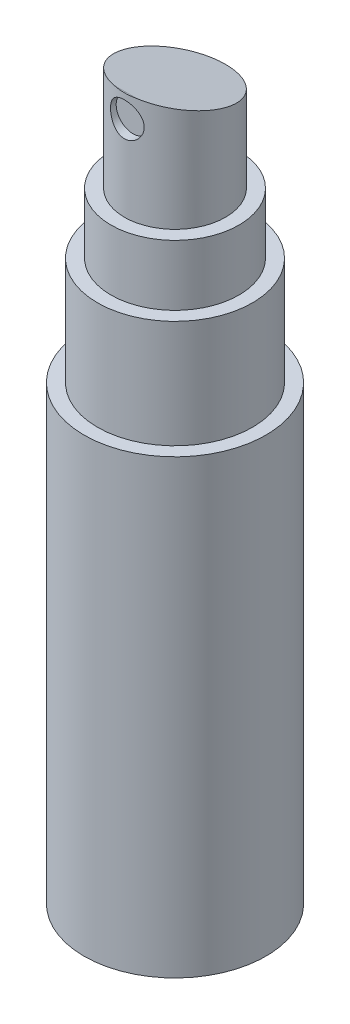
ISO-10303-21;
HEADER;
FILE_DESCRIPTION(('STEP AP214'),'2;1');
FILE_NAME('part.step','',(''),(''),'','','');
FILE_SCHEMA(('AUTOMOTIVE_DESIGN { 1 0 10303 214 1 1 1 1 }'));
ENDSEC;
DATA;
#1=APPLICATION_CONTEXT('core data for automotive mechanical design processes');
#2=APPLICATION_PROTOCOL_DEFINITION('international standard','automotive_design',2000,#1);
#3=PRODUCT_CONTEXT('',#1,'mechanical');
#4=PRODUCT('Part','Part','',(#3));
#5=PRODUCT_RELATED_PRODUCT_CATEGORY('part','',(#4));
#6=PRODUCT_DEFINITION_FORMATION('','',#4);
#7=PRODUCT_DEFINITION_CONTEXT('part definition',#1,'design');
#8=PRODUCT_DEFINITION('design','',#6,#7);
#9=PRODUCT_DEFINITION_SHAPE('','',#8);
#10=(LENGTH_UNIT() NAMED_UNIT(*) SI_UNIT(.MILLI.,.METRE.));
#11=(NAMED_UNIT(*) PLANE_ANGLE_UNIT() SI_UNIT($,.RADIAN.));
#12=(NAMED_UNIT(*) SI_UNIT($,.STERADIAN.) SOLID_ANGLE_UNIT());
#13=UNCERTAINTY_MEASURE_WITH_UNIT(LENGTH_MEASURE(1.E-05),#10,'distance_accuracy_value','');
#14=(GEOMETRIC_REPRESENTATION_CONTEXT(3) GLOBAL_UNCERTAINTY_ASSIGNED_CONTEXT((#13)) GLOBAL_UNIT_ASSIGNED_CONTEXT((#10,
#11,#12)) REPRESENTATION_CONTEXT('',''));
#15=CARTESIAN_POINT('',(0.,0.,0.));
#16=DIRECTION('',(0.,0.,1.));
#17=DIRECTION('',(1.,0.,0.));
#18=AXIS2_PLACEMENT_3D('',#15,#16,#17);
#19=CARTESIAN_POINT('',(0.,67.,0.));
#20=DIRECTION('',(0.,-1.,0.));
#21=DIRECTION('',(0.,0.,-1.));
#22=AXIS2_PLACEMENT_3D('',#19,#20,#21);
#23=CYLINDRICAL_SURFACE('',#22,13.5);
#24=CARTESIAN_POINT('',(0.,67.,0.));
#25=DIRECTION('',(0.,1.,0.));
#26=DIRECTION('',(0.,0.,1.));
#27=AXIS2_PLACEMENT_3D('',#24,#25,#26);
#28=CIRCLE('',#27,13.5);
#29=CARTESIAN_POINT('',(0.,67.,13.5));
#30=VERTEX_POINT('',#29);
#31=EDGE_CURVE('E88',#30,#30,#28,.T.);
#32=ORIENTED_EDGE('',*,*,#31,.F.);
#33=EDGE_LOOP('',(#32));
#34=FACE_BOUND('',#33,.T.);
#35=CARTESIAN_POINT('',(0.,0.,0.));
#36=DIRECTION('',(0.,1.,0.));
#37=DIRECTION('',(0.,0.,1.));
#38=AXIS2_PLACEMENT_3D('',#35,#36,#37);
#39=CIRCLE('',#38,13.5);
#40=CARTESIAN_POINT('',(0.,0.,13.5));
#41=VERTEX_POINT('',#40);
#42=EDGE_CURVE('E85',#41,#41,#39,.T.);
#43=ORIENTED_EDGE('',*,*,#42,.T.);
#44=EDGE_LOOP('',(#43));
#45=FACE_BOUND('',#44,.T.);
#46=ADVANCED_FACE('F38',(#34,#45),#23,.T.);
#47=CARTESIAN_POINT('',(0.,67.,0.));
#48=DIRECTION('',(0.,1.,0.));
#49=DIRECTION('',(0.,0.,1.));
#50=AXIS2_PLACEMENT_3D('',#47,#48,#49);
#51=PLANE('',#50);
#52=CARTESIAN_POINT('',(0.,67.,0.));
#53=DIRECTION('',(0.,1.,0.));
#54=DIRECTION('',(0.,0.,1.));
#55=AXIS2_PLACEMENT_3D('',#52,#53,#54);
#56=CIRCLE('',#55,11.5);
#57=CARTESIAN_POINT('',(0.,67.,11.5));
#58=VERTEX_POINT('',#57);
#59=EDGE_CURVE('E82',#58,#58,#56,.T.);
#60=ORIENTED_EDGE('',*,*,#59,.F.);
#61=EDGE_LOOP('',(#60));
#62=FACE_BOUND('',#61,.T.);
#63=ORIENTED_EDGE('',*,*,#31,.T.);
#64=EDGE_LOOP('',(#63));
#65=FACE_BOUND('',#64,.T.);
#66=ADVANCED_FACE('F98',(#62,#65),#51,.T.);
#67=CARTESIAN_POINT('',(0.,0.,0.));
#68=DIRECTION('',(0.,1.,0.));
#69=DIRECTION('',(0.,0.,1.));
#70=AXIS2_PLACEMENT_3D('',#67,#68,#69);
#71=PLANE('',#70);
#72=ORIENTED_EDGE('',*,*,#42,.F.);
#73=EDGE_LOOP('',(#72));
#74=FACE_BOUND('',#73,.T.);
#75=ADVANCED_FACE('F95',(#74),#71,.F.);
#76=CARTESIAN_POINT('',(0.,83.,0.));
#77=DIRECTION('',(0.,-1.,0.));
#78=DIRECTION('',(0.,0.,-1.));
#79=AXIS2_PLACEMENT_3D('',#76,#77,#78);
#80=CYLINDRICAL_SURFACE('',#79,11.5);
#81=CARTESIAN_POINT('',(0.,83.,0.));
#82=DIRECTION('',(0.,1.,0.));
#83=DIRECTION('',(0.,0.,1.));
#84=AXIS2_PLACEMENT_3D('',#81,#82,#83);
#85=CIRCLE('',#84,11.5);
#86=CARTESIAN_POINT('',(0.,83.,11.5));
#87=VERTEX_POINT('',#86);
#88=EDGE_CURVE('E73',#87,#87,#85,.T.);
#89=ORIENTED_EDGE('',*,*,#88,.F.);
#90=EDGE_LOOP('',(#89));
#91=FACE_BOUND('',#90,.T.);
#92=ORIENTED_EDGE('',*,*,#59,.T.);
#93=EDGE_LOOP('',(#92));
#94=FACE_BOUND('',#93,.T.);
#95=ADVANCED_FACE('F97',(#91,#94),#80,.T.);
#96=CARTESIAN_POINT('',(0.,83.,0.));
#97=DIRECTION('',(0.,1.,0.));
#98=DIRECTION('',(0.,0.,1.));
#99=AXIS2_PLACEMENT_3D('',#96,#97,#98);
#100=PLANE('',#99);
#101=CARTESIAN_POINT('',(0.,83.,0.));
#102=DIRECTION('',(0.,1.,0.));
#103=DIRECTION('',(0.,0.,1.));
#104=AXIS2_PLACEMENT_3D('',#101,#102,#103);
#105=CIRCLE('',#104,9.5);
#106=CARTESIAN_POINT('',(0.,83.,9.5));
#107=VERTEX_POINT('',#106);
#108=EDGE_CURVE('E78',#107,#107,#105,.T.);
#109=ORIENTED_EDGE('',*,*,#108,.F.);
#110=EDGE_LOOP('',(#109));
#111=FACE_BOUND('',#110,.T.);
#112=ORIENTED_EDGE('',*,*,#88,.T.);
#113=EDGE_LOOP('',(#112));
#114=FACE_BOUND('',#113,.T.);
#115=ADVANCED_FACE('F103',(#111,#114),#100,.T.);
#116=CARTESIAN_POINT('',(0.,92.,0.));
#117=DIRECTION('',(0.,-1.,0.));
#118=DIRECTION('',(0.,0.,-1.));
#119=AXIS2_PLACEMENT_3D('',#116,#117,#118);
#120=CYLINDRICAL_SURFACE('',#119,9.5);
#121=CARTESIAN_POINT('',(0.,92.,0.));
#122=DIRECTION('',(0.,1.,0.));
#123=DIRECTION('',(0.,0.,1.));
#124=AXIS2_PLACEMENT_3D('',#121,#122,#123);
#125=CIRCLE('',#124,9.5);
#126=CARTESIAN_POINT('',(0.,92.,9.5));
#127=VERTEX_POINT('',#126);
#128=EDGE_CURVE('E70',#127,#127,#125,.T.);
#129=ORIENTED_EDGE('',*,*,#128,.F.);
#130=EDGE_LOOP('',(#129));
#131=FACE_BOUND('',#130,.T.);
#132=ORIENTED_EDGE('',*,*,#108,.T.);
#133=EDGE_LOOP('',(#132));
#134=FACE_BOUND('',#133,.T.);
#135=ADVANCED_FACE('F137',(#131,#134),#120,.T.);
#136=CARTESIAN_POINT('',(0.,92.,0.));
#137=DIRECTION('',(0.,1.,0.));
#138=DIRECTION('',(0.,0.,1.));
#139=AXIS2_PLACEMENT_3D('',#136,#137,#138);
#140=PLANE('',#139);
#141=CARTESIAN_POINT('',(0.,92.,0.));
#142=DIRECTION('',(0.,1.,0.));
#143=DIRECTION('',(0.,0.,1.));
#144=AXIS2_PLACEMENT_3D('',#141,#142,#143);
#145=CIRCLE('',#144,7.5);
#146=CARTESIAN_POINT('',(0.,92.,7.5));
#147=VERTEX_POINT('',#146);
#148=EDGE_CURVE('E68',#147,#147,#145,.T.);
#149=ORIENTED_EDGE('',*,*,#148,.F.);
#150=EDGE_LOOP('',(#149));
#151=FACE_BOUND('',#150,.T.);
#152=ORIENTED_EDGE('',*,*,#128,.T.);
#153=EDGE_LOOP('',(#152));
#154=FACE_BOUND('',#153,.T.);
#155=ADVANCED_FACE('F148',(#151,#154),#140,.T.);
#156=CARTESIAN_POINT('',(0.,108.,0.));
#157=DIRECTION('',(0.,-1.,0.));
#158=DIRECTION('',(0.,0.,-1.));
#159=AXIS2_PLACEMENT_3D('',#156,#157,#158);
#160=CYLINDRICAL_SURFACE('',#159,7.5);
#161=CARTESIAN_POINT('',(2.5,104.6,7.07106781186547));
#162=CARTESIAN_POINT('',(2.50000064486929,104.46382956291,7.07106736326085));
#163=CARTESIAN_POINT('',(2.48883695921381,104.327663000441,7.07504423227143));
#164=CARTESIAN_POINT('',(2.44462782922203,104.059363947514,7.09043935203137));
#165=CARTESIAN_POINT('',(2.411578780421,103.927232125319,7.10185882855472));
#166=CARTESIAN_POINT('',(2.32488871421226,103.670932767507,7.13070509221979));
#167=CARTESIAN_POINT('',(2.27128805350812,103.546750176393,7.14812009928304));
#168=CARTESIAN_POINT('',(2.14515407110345,103.30909987863,7.18697805025811));
#169=CARTESIAN_POINT('',(2.07261657215046,103.195634543616,7.20842188259031));
#170=CARTESIAN_POINT('',(1.9076278661072,102.978200094154,7.25386223518683));
#171=CARTESIAN_POINT('',(1.8145608534448,102.874711428321,7.2779223711161));
#172=CARTESIAN_POINT('',(1.612469168036,102.684482996938,7.32534662002507));
#173=CARTESIAN_POINT('',(1.50344193763095,102.597745921044,7.34871062072404));
#174=CARTESIAN_POINT('',(1.26901126991254,102.441302756676,7.39284667304497));
#175=CARTESIAN_POINT('',(1.14325477806132,102.372100073455,7.41353519254014));
#176=CARTESIAN_POINT('',(0.881078057468692,102.256021037181,7.44923966927457));
#177=CARTESIAN_POINT('',(0.744660714218035,102.209138667058,7.46425715507505));
#178=CARTESIAN_POINT('',(0.470072043583738,102.140660363419,7.48647688579767));
#179=CARTESIAN_POINT('',(0.332126887132423,102.118241384357,7.49393286943898));
#180=CARTESIAN_POINT('',(0.0542446870602263,102.096709266598,7.5010902054562));
#181=CARTESIAN_POINT('',(-0.0856918338597383,102.097590120869,7.50079355657239));
#182=CARTESIAN_POINT('',(-0.357758787984535,102.122110636415,7.49265099046828));
#183=CARTESIAN_POINT('',(-0.48998012147914,102.144856321186,7.48510161887793));
#184=CARTESIAN_POINT('',(-0.748608597055428,102.210982452451,7.46367418349329));
#185=CARTESIAN_POINT('',(-0.875015344448039,102.25436429745,7.44979569077954));
#186=CARTESIAN_POINT('',(-1.12038118710493,102.361053293265,7.41689175733061));
#187=CARTESIAN_POINT('',(-1.23922055242211,102.424614846366,7.39780106310039));
#188=CARTESIAN_POINT('',(-1.4648108138183,102.569649263622,7.35645982597298));
#189=CARTESIAN_POINT('',(-1.57155833596335,102.651127108319,7.33420840503667));
#190=CARTESIAN_POINT('',(-1.77525216637827,102.834185983649,7.28765479624741));
#191=CARTESIAN_POINT('',(-1.87150039266318,102.936532894604,7.26330537922194));
#192=CARTESIAN_POINT('',(-2.04569314899544,103.156121814317,7.21618338122252));
#193=CARTESIAN_POINT('',(-2.12363485820386,103.27336611432,7.19341104364038));
#194=CARTESIAN_POINT('',(-2.25996863758936,103.521634064009,7.15176312802781));
#195=CARTESIAN_POINT('',(-2.31806615905335,103.652830328294,7.1329477321187));
#196=CARTESIAN_POINT('',(-2.41110798317334,103.923928485536,7.10204127060962));
#197=CARTESIAN_POINT('',(-2.44606198936874,104.063826703016,7.08994738717732));
#198=CARTESIAN_POINT('',(-2.49040320524381,104.341595888529,7.07449090788963));
#199=CARTESIAN_POINT('',(-2.50087273876909,104.479273561872,7.0707590079689));
#200=CARTESIAN_POINT('',(-2.4990135972743,104.754440372785,7.07141680147961));
#201=CARTESIAN_POINT('',(-2.48668906306691,104.89192954006,7.07580501979536));
#202=CARTESIAN_POINT('',(-2.44056412888078,105.15789241428,7.09184045225748));
#203=CARTESIAN_POINT('',(-2.40751598495171,105.286513575377,7.10323313602101));
#204=CARTESIAN_POINT('',(-2.32178465640117,105.536359015598,7.13171384177557));
#205=CARTESIAN_POINT('',(-2.26909799090856,105.657581978977,7.14880287337099));
#206=CARTESIAN_POINT('',(-2.14368585184735,105.893451052117,7.18742193989467));
#207=CARTESIAN_POINT('',(-2.07037779589625,106.007766606604,7.2090756416407));
#208=CARTESIAN_POINT('',(-1.9064640763939,106.222865130959,7.25414421827413));
#209=CARTESIAN_POINT('',(-1.81585331374696,106.323644096653,7.27755961109486));
#210=CARTESIAN_POINT('',(-1.61472926475082,106.513819960227,7.32487596594622));
#211=CARTESIAN_POINT('',(-1.50346817636664,106.602435975047,7.34874608944741));
#212=CARTESIAN_POINT('',(-1.26706822850066,106.75979035587,7.39317129032772));
#213=CARTESIAN_POINT('',(-1.14192986216139,106.828529427906,7.41372648544237));
#214=CARTESIAN_POINT('',(-0.88194965608075,106.943550262154,7.44911014526507));
#215=CARTESIAN_POINT('',(-0.747177808303,106.98997819287,7.46397575011328));
#216=CARTESIAN_POINT('',(-0.471146164615046,107.05931935515,7.48646527094436));
#217=CARTESIAN_POINT('',(-0.329888729884726,107.082241074701,7.49409180085047));
#218=CARTESIAN_POINT('',(-0.052038339650101,107.103155194014,7.50104658090641));
#219=CARTESIAN_POINT('',(0.0844618098000481,107.102268634831,7.50074800223598));
#220=CARTESIAN_POINT('',(0.355277862500436,107.078356729634,7.49280491298495));
#221=CARTESIAN_POINT('',(0.489593942047642,107.055333179618,7.48516099833939));
#222=CARTESIAN_POINT('',(0.750105298580149,106.98854441356,7.46352287386031));
#223=CARTESIAN_POINT('',(0.876395677281976,106.945114461618,7.44963145902871));
#224=CARTESIAN_POINT('',(1.11994587734949,106.839056172257,7.41692901761237));
#225=CARTESIAN_POINT('',(1.23720406035608,106.776424362007,7.39811710120041));
#226=CARTESIAN_POINT('',(1.46408504077196,106.631076219745,7.35664672069702));
#227=CARTESIAN_POINT('',(1.57326562889401,106.547703286546,7.33387181229816));
#228=CARTESIAN_POINT('',(1.77645256568106,106.36435652211,7.28732471979699));
#229=CARTESIAN_POINT('',(1.87045405406148,106.264377394343,7.26355221932743));
#230=CARTESIAN_POINT('',(2.0443545220828,106.045976611033,7.21658199563995));
#231=CARTESIAN_POINT('',(2.12355741499475,105.926986222558,7.19344319971577));
#232=CARTESIAN_POINT('',(2.26078585825279,105.676663932743,7.15150483307538));
#233=CARTESIAN_POINT('',(2.31881694204869,105.545335267426,7.13270412903123));
#234=CARTESIAN_POINT('',(2.40960957051042,105.280095439961,7.10253335516286));
#235=CARTESIAN_POINT('',(2.4433947728738,105.146569341187,7.09086582142956));
#236=CARTESIAN_POINT('',(2.48858580037317,104.875359873833,7.07513458848795));
#237=CARTESIAN_POINT('',(2.49999934799148,104.737677956473,7.07106826543653));
#238=CARTESIAN_POINT('',(2.5,104.6,7.07106781186547));
#239=B_SPLINE_CURVE_WITH_KNOTS('',3,(#161,#162,#163,#164,#165,#166,#167,#168,#169,#170,#171,
#172,#173,#174,#175,#176,#177,#178,#179,#180,#181,#182,#183,#184,#185,#186,#187,#188,#189,#190,
#191,#192,#193,#194,#195,#196,#197,#198,#199,#200,#201,#202,#203,#204,#205,#206,#207,#208,#209,
#210,#211,#212,#213,#214,#215,#216,#217,#218,#219,#220,#221,#222,#223,#224,#225,#226,#227,#228,
#229,#230,#231,#232,#233,#234,#235,#236,#237,#238),.UNSPECIFIED.,.T.,.F.,(4,2,2,2,2,2,2,2,2,2,2,
2,2,2,2,2,2,2,2,2,2,2,2,2,2,2,2,2,2,2,2,2,2,2,2,2,2,2,4),(0.,0.408001461998376,
0.816070137537907,1.22334156875208,1.63070291546361,2.0525334356892,2.47443162929968,
2.90733765359142,3.34012690966973,3.75785796912336,4.17548133255818,4.57672512063922,
4.97799610473092,5.38454137150838,5.79119979685055,6.21700435909794,6.64287449030266,
7.07481599607639,7.5065762839154,7.91885728411101,8.33106339593084,8.72910989421941,
9.12722697867365,9.53797144339286,9.94883714155318,10.3794702042773,10.8100879689383,
11.2378447797713,11.6654470751039,12.0729521169409,12.4804241002445,12.8814239010108,
13.2824962690811,13.6983879880158,14.1144126108158,14.5467225684036,14.9789194566717,
15.3915803040673,15.8040986797616),.UNSPECIFIED.);
#240=CARTESIAN_POINT('',(2.5,104.6,7.07106781186547));
#241=VERTEX_POINT('',#240);
#242=EDGE_CURVE('E11',#241,#241,#239,.T.);
#243=ORIENTED_EDGE('',*,*,#242,.T.);
#244=EDGE_LOOP('',(#243));
#245=FACE_BOUND('',#244,.T.);
#246=CARTESIAN_POINT('',(0.,106.107430410435,0.));
#247=DIRECTION('',(0.,-0.968157252315573,0.250342834506523));
#248=DIRECTION('',(0.,-0.250342834506523,-0.968157252315573));
#249=AXIS2_PLACEMENT_3D('',#246,#247,#248);
#250=ELLIPSE('',#249,7.74667543114717,7.5);
#251=CARTESIAN_POINT('',(-1.63693702828931,108.,7.31918282087662));
#252=VERTEX_POINT('',#251);
#253=CARTESIAN_POINT('',(1.63693702828931,108.,7.31918282087662));
#254=VERTEX_POINT('',#253);
#255=EDGE_CURVE('E56',#252,#254,#250,.T.);
#256=ORIENTED_EDGE('',*,*,#255,.T.);
#257=CARTESIAN_POINT('',(0.,108.,0.));
#258=DIRECTION('',(0.,1.,0.));
#259=DIRECTION('',(0.,0.,1.));
#260=AXIS2_PLACEMENT_3D('',#257,#258,#259);
#261=CIRCLE('',#260,7.5);
#262=EDGE_CURVE('E63',#252,#254,#261,.T.);
#263=ORIENTED_EDGE('',*,*,#262,.F.);
#264=EDGE_LOOP('',(#256,#263));
#265=FACE_BOUND('',#264,.T.);
#266=ORIENTED_EDGE('',*,*,#148,.T.);
#267=EDGE_LOOP('',(#266));
#268=FACE_BOUND('',#267,.T.);
#269=ADVANCED_FACE('F60',(#245,#265,#268),#160,.T.);
#270=CARTESIAN_POINT('',(0.,108.,0.));
#271=DIRECTION('',(0.,1.,0.));
#272=DIRECTION('',(0.,0.,1.));
#273=AXIS2_PLACEMENT_3D('',#270,#271,#272);
#274=PLANE('',#273);
#275=DIRECTION('',(1.,0.,0.));
#276=VECTOR('',#275,1.);
#277=CARTESIAN_POINT('',(0.,108.,7.31918282087662));
#278=LINE('',#277,#276);
#279=EDGE_CURVE('E50',#252,#254,#278,.T.);
#280=ORIENTED_EDGE('',*,*,#279,.F.);
#281=ORIENTED_EDGE('',*,*,#262,.T.);
#282=EDGE_LOOP('',(#280,#281));
#283=FACE_BOUND('',#282,.T.);
#284=ADVANCED_FACE('F69',(#283),#274,.T.);
#285=CARTESIAN_POINT('',(-13.5,108.,7.31918282087662));
#286=DIRECTION('',(0.,-0.968157252315573,0.250342834506523));
#287=DIRECTION('',(0.,-0.250342834506523,-0.968157252315573));
#288=AXIS2_PLACEMENT_3D('',#285,#286,#287);
#289=PLANE('',#288);
#290=ORIENTED_EDGE('',*,*,#255,.F.);
#291=ORIENTED_EDGE('',*,*,#279,.T.);
#292=EDGE_LOOP('',(#290,#291));
#293=FACE_BOUND('',#292,.T.);
#294=ADVANCED_FACE('F66',(#293),#289,.F.);
#295=CARTESIAN_POINT('',(0.,104.6,6.23));
#296=DIRECTION('',(0.,0.,1.));
#297=DIRECTION('',(1.,0.,0.));
#298=AXIS2_PLACEMENT_3D('',#295,#296,#297);
#299=CYLINDRICAL_SURFACE('',#298,2.5);
#300=CARTESIAN_POINT('',(0.,104.6,6.23));
#301=DIRECTION('',(0.,0.,1.));
#302=DIRECTION('',(1.,0.,0.));
#303=AXIS2_PLACEMENT_3D('',#300,#301,#302);
#304=CIRCLE('',#303,2.5);
#305=CARTESIAN_POINT('',(2.5,104.6,6.23));
#306=VERTEX_POINT('',#305);
#307=EDGE_CURVE('E64',#306,#306,#304,.T.);
#308=ORIENTED_EDGE('',*,*,#307,.F.);
#309=EDGE_LOOP('',(#308));
#310=FACE_BOUND('',#309,.T.);
#311=ORIENTED_EDGE('',*,*,#242,.F.);
#312=EDGE_LOOP('',(#311));
#313=FACE_BOUND('',#312,.T.);
#314=ADVANCED_FACE('F180',(#310,#313),#299,.F.);
#315=CARTESIAN_POINT('',(0.,104.6,6.23));
#316=DIRECTION('',(0.,0.,1.));
#317=DIRECTION('',(1.,0.,0.));
#318=AXIS2_PLACEMENT_3D('',#315,#316,#317);
#319=PLANE('',#318);
#320=ORIENTED_EDGE('',*,*,#307,.T.);
#321=EDGE_LOOP('',(#320));
#322=FACE_BOUND('',#321,.T.);
#323=ADVANCED_FACE('F197',(#322),#319,.T.);
#324=CLOSED_SHELL('',(#46,#66,#75,#95,#115,#135,#155,#269,#284,#294,#314,#323));
#325=MANIFOLD_SOLID_BREP('B2',#324);
#326=ADVANCED_BREP_SHAPE_REPRESENTATION('',(#18,#325),#14);
#327=SHAPE_DEFINITION_REPRESENTATION(#9,#326);
ENDSEC;
END-ISO-10303-21;
